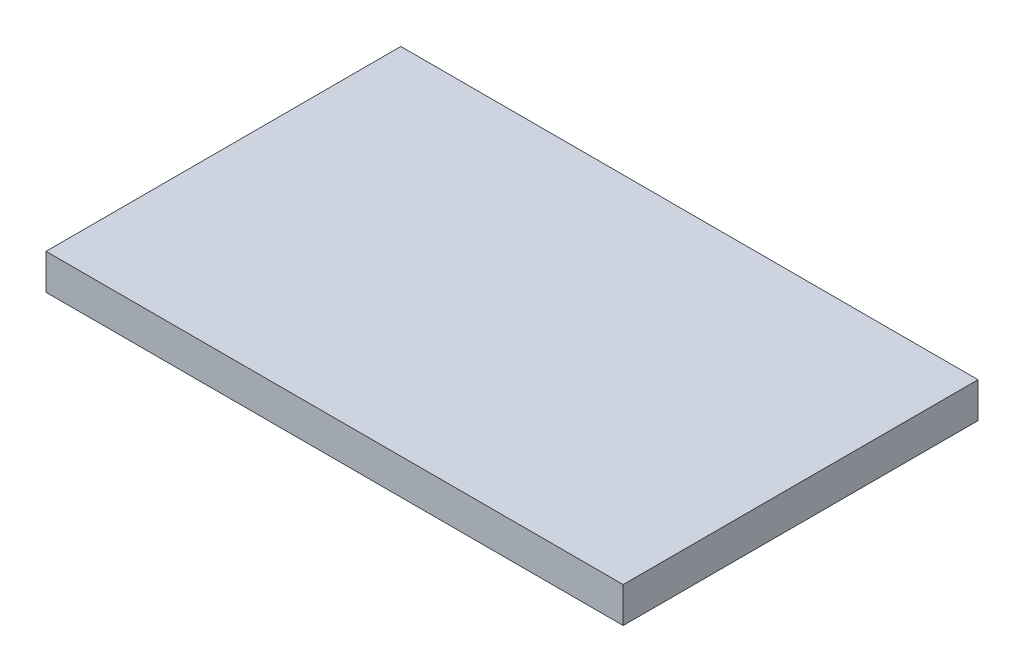
ISO-10303-21;
HEADER;
FILE_DESCRIPTION(('STEP AP214'),'2;1');
FILE_NAME('part.step','',(''),(''),'','','');
FILE_SCHEMA(('AUTOMOTIVE_DESIGN { 1 0 10303 214 1 1 1 1 }'));
ENDSEC;
DATA;
#1=APPLICATION_CONTEXT('core data for automotive mechanical design processes');
#2=APPLICATION_PROTOCOL_DEFINITION('international standard','automotive_design',2000,#1);
#3=PRODUCT_CONTEXT('',#1,'mechanical');
#4=PRODUCT('Part','Part','',(#3));
#5=PRODUCT_RELATED_PRODUCT_CATEGORY('part','',(#4));
#6=PRODUCT_DEFINITION_FORMATION('','',#4);
#7=PRODUCT_DEFINITION_CONTEXT('part definition',#1,'design');
#8=PRODUCT_DEFINITION('design','',#6,#7);
#9=PRODUCT_DEFINITION_SHAPE('','',#8);
#10=(LENGTH_UNIT() NAMED_UNIT(*) SI_UNIT(.MILLI.,.METRE.));
#11=(NAMED_UNIT(*) PLANE_ANGLE_UNIT() SI_UNIT($,.RADIAN.));
#12=(NAMED_UNIT(*) SI_UNIT($,.STERADIAN.) SOLID_ANGLE_UNIT());
#13=UNCERTAINTY_MEASURE_WITH_UNIT(LENGTH_MEASURE(1.E-05),#10,'distance_accuracy_value','');
#14=(GEOMETRIC_REPRESENTATION_CONTEXT(3) GLOBAL_UNCERTAINTY_ASSIGNED_CONTEXT((#13)) GLOBAL_UNIT_ASSIGNED_CONTEXT((#10,
#11,#12)) REPRESENTATION_CONTEXT('',''));
#15=CARTESIAN_POINT('',(0.,0.,0.));
#16=DIRECTION('',(0.,0.,1.));
#17=DIRECTION('',(1.,0.,0.));
#18=AXIS2_PLACEMENT_3D('',#15,#16,#17);
#19=CARTESIAN_POINT('',(122.,15.,75.));
#20=DIRECTION('',(-1.,0.,0.));
#21=DIRECTION('',(0.,0.,1.));
#22=AXIS2_PLACEMENT_3D('',#19,#20,#21);
#23=PLANE('',#22);
#24=DIRECTION('',(0.,0.,-1.));
#25=VECTOR('',#24,1.);
#26=CARTESIAN_POINT('',(122.,0.,75.));
#27=LINE('',#26,#25);
#28=CARTESIAN_POINT('',(122.,0.,75.));
#29=VERTEX_POINT('',#28);
#30=CARTESIAN_POINT('',(122.,0.,-75.));
#31=VERTEX_POINT('',#30);
#32=EDGE_CURVE('E95',#29,#31,#27,.T.);
#33=ORIENTED_EDGE('',*,*,#32,.T.);
#34=DIRECTION('',(0.,-1.,0.));
#35=VECTOR('',#34,1.);
#36=CARTESIAN_POINT('',(122.,15.,-75.));
#37=LINE('',#36,#35);
#38=CARTESIAN_POINT('',(122.,15.,-75.));
#39=VERTEX_POINT('',#38);
#40=EDGE_CURVE('E11',#39,#31,#37,.T.);
#41=ORIENTED_EDGE('',*,*,#40,.F.);
#42=DIRECTION('',(0.,0.,-1.));
#43=VECTOR('',#42,1.);
#44=CARTESIAN_POINT('',(122.,15.,75.));
#45=LINE('',#44,#43);
#46=CARTESIAN_POINT('',(122.,15.,75.));
#47=VERTEX_POINT('',#46);
#48=EDGE_CURVE('E83',#47,#39,#45,.T.);
#49=ORIENTED_EDGE('',*,*,#48,.F.);
#50=DIRECTION('',(0.,-1.,0.));
#51=VECTOR('',#50,1.);
#52=CARTESIAN_POINT('',(122.,15.,75.));
#53=LINE('',#52,#51);
#54=EDGE_CURVE('E91',#47,#29,#53,.T.);
#55=ORIENTED_EDGE('',*,*,#54,.T.);
#56=EDGE_LOOP('',(#33,#41,#49,#55));
#57=FACE_BOUND('',#56,.T.);
#58=ADVANCED_FACE('F32',(#57),#23,.F.);
#59=CARTESIAN_POINT('',(-122.,15.,-75.));
#60=DIRECTION('',(0.,0.,1.));
#61=DIRECTION('',(1.,0.,0.));
#62=AXIS2_PLACEMENT_3D('',#59,#60,#61);
#63=PLANE('',#62);
#64=DIRECTION('',(-1.,0.,0.));
#65=VECTOR('',#64,1.);
#66=CARTESIAN_POINT('',(-122.,0.,-75.));
#67=LINE('',#66,#65);
#68=CARTESIAN_POINT('',(-122.,0.,-75.));
#69=VERTEX_POINT('',#68);
#70=EDGE_CURVE('E87',#31,#69,#67,.T.);
#71=ORIENTED_EDGE('',*,*,#70,.T.);
#72=DIRECTION('',(0.,-1.,0.));
#73=VECTOR('',#72,1.);
#74=CARTESIAN_POINT('',(-122.,15.,-75.));
#75=LINE('',#74,#73);
#76=CARTESIAN_POINT('',(-122.,15.,-75.));
#77=VERTEX_POINT('',#76);
#78=EDGE_CURVE('E40',#77,#69,#75,.T.);
#79=ORIENTED_EDGE('',*,*,#78,.F.);
#80=DIRECTION('',(-1.,0.,0.));
#81=VECTOR('',#80,1.);
#82=CARTESIAN_POINT('',(-122.,15.,-75.));
#83=LINE('',#82,#81);
#84=EDGE_CURVE('E78',#39,#77,#83,.T.);
#85=ORIENTED_EDGE('',*,*,#84,.F.);
#86=ORIENTED_EDGE('',*,*,#40,.T.);
#87=EDGE_LOOP('',(#71,#79,#85,#86));
#88=FACE_BOUND('',#87,.T.);
#89=ADVANCED_FACE('F86',(#88),#63,.F.);
#90=CARTESIAN_POINT('',(-122.,15.,75.));
#91=DIRECTION('',(1.,0.,0.));
#92=DIRECTION('',(0.,0.,-1.));
#93=AXIS2_PLACEMENT_3D('',#90,#91,#92);
#94=PLANE('',#93);
#95=DIRECTION('',(0.,0.,1.));
#96=VECTOR('',#95,1.);
#97=CARTESIAN_POINT('',(-122.,0.,75.));
#98=LINE('',#97,#96);
#99=CARTESIAN_POINT('',(-122.,0.,75.));
#100=VERTEX_POINT('',#99);
#101=EDGE_CURVE('E65',#69,#100,#98,.T.);
#102=ORIENTED_EDGE('',*,*,#101,.T.);
#103=DIRECTION('',(0.,-1.,0.));
#104=VECTOR('',#103,1.);
#105=CARTESIAN_POINT('',(-122.,15.,75.));
#106=LINE('',#105,#104);
#107=CARTESIAN_POINT('',(-122.,15.,75.));
#108=VERTEX_POINT('',#107);
#109=EDGE_CURVE('E88',#108,#100,#106,.T.);
#110=ORIENTED_EDGE('',*,*,#109,.F.);
#111=DIRECTION('',(0.,0.,1.));
#112=VECTOR('',#111,1.);
#113=CARTESIAN_POINT('',(-122.,15.,75.));
#114=LINE('',#113,#112);
#115=EDGE_CURVE('E81',#77,#108,#114,.T.);
#116=ORIENTED_EDGE('',*,*,#115,.F.);
#117=ORIENTED_EDGE('',*,*,#78,.T.);
#118=EDGE_LOOP('',(#102,#110,#116,#117));
#119=FACE_BOUND('',#118,.T.);
#120=ADVANCED_FACE('F89',(#119),#94,.F.);
#121=CARTESIAN_POINT('',(-122.,15.,75.));
#122=DIRECTION('',(0.,0.,-1.));
#123=DIRECTION('',(-1.,0.,0.));
#124=AXIS2_PLACEMENT_3D('',#121,#122,#123);
#125=PLANE('',#124);
#126=DIRECTION('',(1.,0.,0.));
#127=VECTOR('',#126,1.);
#128=CARTESIAN_POINT('',(-122.,0.,75.));
#129=LINE('',#128,#127);
#130=EDGE_CURVE('E71',#100,#29,#129,.T.);
#131=ORIENTED_EDGE('',*,*,#130,.T.);
#132=ORIENTED_EDGE('',*,*,#54,.F.);
#133=DIRECTION('',(1.,0.,0.));
#134=VECTOR('',#133,1.);
#135=CARTESIAN_POINT('',(-122.,15.,75.));
#136=LINE('',#135,#134);
#137=EDGE_CURVE('E48',#108,#47,#136,.T.);
#138=ORIENTED_EDGE('',*,*,#137,.F.);
#139=ORIENTED_EDGE('',*,*,#109,.T.);
#140=EDGE_LOOP('',(#131,#132,#138,#139));
#141=FACE_BOUND('',#140,.T.);
#142=ADVANCED_FACE('F102',(#141),#125,.F.);
#143=CARTESIAN_POINT('',(0.,15.,0.));
#144=DIRECTION('',(0.,-1.,0.));
#145=DIRECTION('',(0.,0.,-1.));
#146=AXIS2_PLACEMENT_3D('',#143,#144,#145);
#147=PLANE('',#146);
#148=ORIENTED_EDGE('',*,*,#48,.T.);
#149=ORIENTED_EDGE('',*,*,#84,.T.);
#150=ORIENTED_EDGE('',*,*,#115,.T.);
#151=ORIENTED_EDGE('',*,*,#137,.T.);
#152=EDGE_LOOP('',(#148,#149,#150,#151));
#153=FACE_BOUND('',#152,.T.);
#154=ADVANCED_FACE('F79',(#153),#147,.F.);
#155=CARTESIAN_POINT('',(0.,0.,0.));
#156=DIRECTION('',(0.,-1.,0.));
#157=DIRECTION('',(0.,0.,-1.));
#158=AXIS2_PLACEMENT_3D('',#155,#156,#157);
#159=PLANE('',#158);
#160=ORIENTED_EDGE('',*,*,#32,.F.);
#161=ORIENTED_EDGE('',*,*,#130,.F.);
#162=ORIENTED_EDGE('',*,*,#101,.F.);
#163=ORIENTED_EDGE('',*,*,#70,.F.);
#164=EDGE_LOOP('',(#160,#161,#162,#163));
#165=FACE_BOUND('',#164,.T.);
#166=ADVANCED_FACE('F105',(#165),#159,.T.);
#167=CLOSED_SHELL('',(#58,#89,#120,#142,#154,#166));
#168=MANIFOLD_SOLID_BREP('B2',#167);
#169=ADVANCED_BREP_SHAPE_REPRESENTATION('',(#18,#168),#14);
#170=SHAPE_DEFINITION_REPRESENTATION(#9,#169);
ENDSEC;
END-ISO-10303-21;
